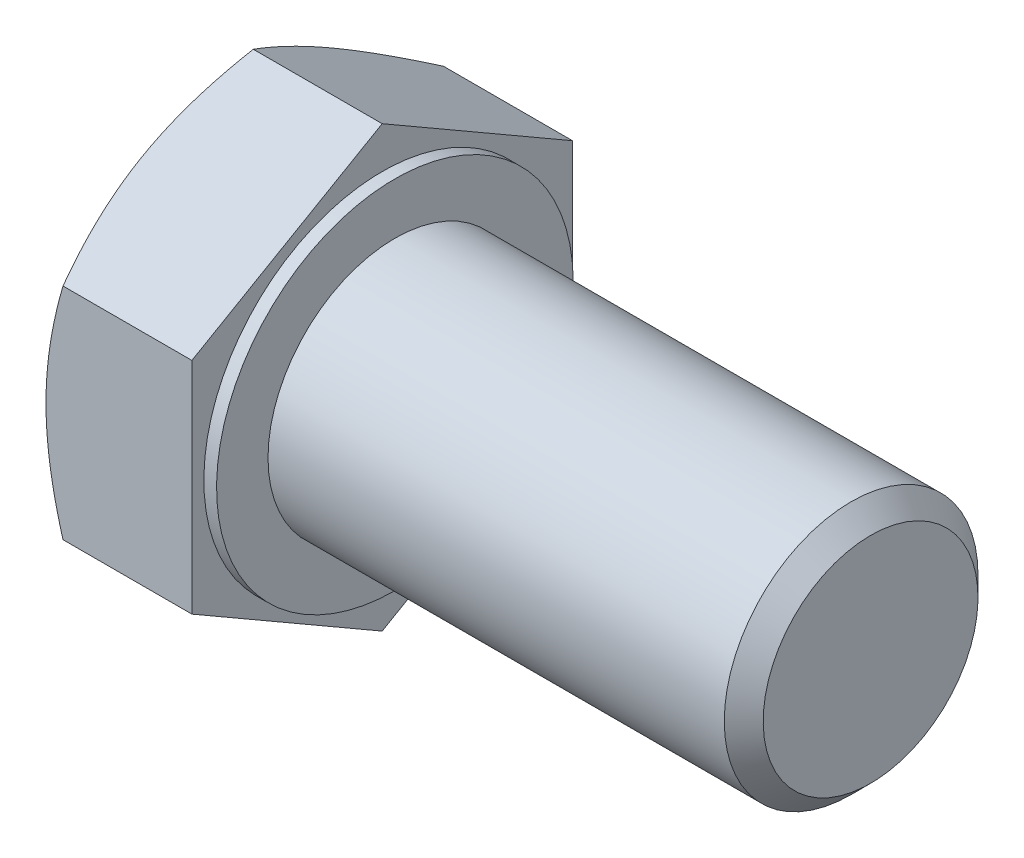
ISO-10303-21;
HEADER;
FILE_DESCRIPTION(('STEP AP214'),'2;1');
FILE_NAME('part.step','',(''),(''),'','','');
FILE_SCHEMA(('AUTOMOTIVE_DESIGN { 1 0 10303 214 1 1 1 1 }'));
ENDSEC;
DATA;
#1=APPLICATION_CONTEXT('core data for automotive mechanical design processes');
#2=APPLICATION_PROTOCOL_DEFINITION('international standard','automotive_design',2000,#1);
#3=PRODUCT_CONTEXT('',#1,'mechanical');
#4=PRODUCT('Part','Part','',(#3));
#5=PRODUCT_RELATED_PRODUCT_CATEGORY('part','',(#4));
#6=PRODUCT_DEFINITION_FORMATION('','',#4);
#7=PRODUCT_DEFINITION_CONTEXT('part definition',#1,'design');
#8=PRODUCT_DEFINITION('design','',#6,#7);
#9=PRODUCT_DEFINITION_SHAPE('','',#8);
#10=(LENGTH_UNIT() NAMED_UNIT(*) SI_UNIT(.MILLI.,.METRE.));
#11=(NAMED_UNIT(*) PLANE_ANGLE_UNIT() SI_UNIT($,.RADIAN.));
#12=(NAMED_UNIT(*) SI_UNIT($,.STERADIAN.) SOLID_ANGLE_UNIT());
#13=UNCERTAINTY_MEASURE_WITH_UNIT(LENGTH_MEASURE(1.E-05),#10,'distance_accuracy_value','');
#14=(GEOMETRIC_REPRESENTATION_CONTEXT(3) GLOBAL_UNCERTAINTY_ASSIGNED_CONTEXT((#13)) GLOBAL_UNIT_ASSIGNED_CONTEXT((#10,
#11,#12)) REPRESENTATION_CONTEXT('',''));
#15=CARTESIAN_POINT('',(0.,0.,0.));
#16=DIRECTION('',(0.,0.,1.));
#17=DIRECTION('',(1.,0.,0.));
#18=AXIS2_PLACEMENT_3D('',#15,#16,#17);
#19=CARTESIAN_POINT('',(0.,9.6225,0.));
#20=DIRECTION('',(1.,0.,0.));
#21=DIRECTION('',(0.,1.,0.));
#22=AXIS2_PLACEMENT_3D('',#19,#20,#21);
#23=PLANE('',#22);
#24=CARTESIAN_POINT('',(0.,0.,0.));
#25=DIRECTION('',(1.,0.,0.));
#26=DIRECTION('',(0.,1.,0.));
#27=AXIS2_PLACEMENT_3D('',#24,#25,#26);
#28=CIRCLE('',#27,8.);
#29=CARTESIAN_POINT('',(0.,-8.,0.));
#30=VERTEX_POINT('',#29);
#31=EDGE_CURVE('E177',#30,#30,#28,.T.);
#32=ORIENTED_EDGE('',*,*,#31,.F.);
#33=EDGE_LOOP('',(#32));
#34=FACE_BOUND('',#33,.T.);
#35=CARTESIAN_POINT('',(0.,0.,0.));
#36=DIRECTION('',(1.,0.,0.));
#37=DIRECTION('',(0.,1.,0.));
#38=AXIS2_PLACEMENT_3D('',#35,#36,#37);
#39=CIRCLE('',#38,11.245);
#40=CARTESIAN_POINT('',(0.,-11.245,0.));
#41=VERTEX_POINT('',#40);
#42=EDGE_CURVE('E27',#41,#41,#39,.T.);
#43=ORIENTED_EDGE('',*,*,#42,.T.);
#44=EDGE_LOOP('',(#43));
#45=FACE_BOUND('',#44,.T.);
#46=ADVANCED_FACE('F17',(#34,#45),#23,.T.);
#47=CARTESIAN_POINT('',(-0.40005,0.,0.));
#48=DIRECTION('',(1.,0.,0.));
#49=DIRECTION('',(0.,1.,0.));
#50=AXIS2_PLACEMENT_3D('',#47,#48,#49);
#51=CYLINDRICAL_SURFACE('',#50,11.245);
#52=ORIENTED_EDGE('',*,*,#42,.F.);
#53=DIRECTION('',(-1.,0.,0.));
#54=VECTOR('',#53,1.);
#55=CARTESIAN_POINT('',(-0.40005,-11.245,0.));
#56=LINE('',#55,#54);
#57=CARTESIAN_POINT('',(-0.8001,-11.245,0.));
#58=VERTEX_POINT('',#57);
#59=EDGE_CURVE('E11',#41,#58,#56,.T.);
#60=ORIENTED_EDGE('',*,*,#59,.T.);
#61=CARTESIAN_POINT('',(-0.8001,0.,0.));
#62=DIRECTION('',(1.,0.,0.));
#63=DIRECTION('',(0.,1.,0.));
#64=AXIS2_PLACEMENT_3D('',#61,#62,#63);
#65=CIRCLE('',#64,11.245);
#66=EDGE_CURVE('E241',#58,#58,#65,.T.);
#67=ORIENTED_EDGE('',*,*,#66,.T.);
#68=ORIENTED_EDGE('',*,*,#59,.F.);
#69=EDGE_LOOP('',(#52,#60,#67,#68));
#70=FACE_BOUND('',#69,.T.);
#71=ADVANCED_FACE('F346',(#70),#51,.T.);
#72=CARTESIAN_POINT('',(-10.0001,0.,0.));
#73=DIRECTION('',(1.,0.,0.));
#74=DIRECTION('',(0.,1.,0.));
#75=AXIS2_PLACEMENT_3D('',#72,#73,#74);
#76=PLANE('',#75);
#77=CARTESIAN_POINT('',(-10.0001,0.,0.));
#78=DIRECTION('',(-1.,0.,0.));
#79=DIRECTION('',(0.,1.,0.));
#80=AXIS2_PLACEMENT_3D('',#77,#78,#79);
#81=CIRCLE('',#80,12.);
#82=CARTESIAN_POINT('',(-10.0001,0.,12.));
#83=VERTEX_POINT('',#82);
#84=CARTESIAN_POINT('',(-10.0001,10.3923048454133,6.));
#85=VERTEX_POINT('',#84);
#86=EDGE_CURVE('E141',#83,#85,#81,.T.);
#87=ORIENTED_EDGE('',*,*,#86,.T.);
#88=CARTESIAN_POINT('',(-10.0001,0.,0.));
#89=DIRECTION('',(-1.,0.,0.));
#90=DIRECTION('',(0.,1.,0.));
#91=AXIS2_PLACEMENT_3D('',#88,#89,#90);
#92=CIRCLE('',#91,12.);
#93=CARTESIAN_POINT('',(-10.0001,10.3923048454133,-6.));
#94=VERTEX_POINT('',#93);
#95=EDGE_CURVE('E186',#85,#94,#92,.T.);
#96=ORIENTED_EDGE('',*,*,#95,.T.);
#97=CARTESIAN_POINT('',(-10.0001,0.,0.));
#98=DIRECTION('',(-1.,0.,0.));
#99=DIRECTION('',(0.,1.,0.));
#100=AXIS2_PLACEMENT_3D('',#97,#98,#99);
#101=CIRCLE('',#100,12.);
#102=CARTESIAN_POINT('',(-10.0001,0.,-12.));
#103=VERTEX_POINT('',#102);
#104=EDGE_CURVE('E200',#94,#103,#101,.T.);
#105=ORIENTED_EDGE('',*,*,#104,.T.);
#106=CARTESIAN_POINT('',(-10.0001,0.,0.));
#107=DIRECTION('',(-1.,0.,0.));
#108=DIRECTION('',(0.,1.,0.));
#109=AXIS2_PLACEMENT_3D('',#106,#107,#108);
#110=CIRCLE('',#109,12.);
#111=CARTESIAN_POINT('',(-10.0001,-10.3923048454133,-6.));
#112=VERTEX_POINT('',#111);
#113=EDGE_CURVE('E111',#103,#112,#110,.T.);
#114=ORIENTED_EDGE('',*,*,#113,.T.);
#115=CARTESIAN_POINT('',(-10.0001,0.,0.));
#116=DIRECTION('',(-1.,0.,0.));
#117=DIRECTION('',(0.,1.,0.));
#118=AXIS2_PLACEMENT_3D('',#115,#116,#117);
#119=CIRCLE('',#118,12.);
#120=CARTESIAN_POINT('',(-10.0001,-10.3923048454133,6.));
#121=VERTEX_POINT('',#120);
#122=EDGE_CURVE('E144',#112,#121,#119,.T.);
#123=ORIENTED_EDGE('',*,*,#122,.T.);
#124=CARTESIAN_POINT('',(-10.0001,0.,0.));
#125=DIRECTION('',(-1.,0.,0.));
#126=DIRECTION('',(0.,1.,0.));
#127=AXIS2_PLACEMENT_3D('',#124,#125,#126);
#128=CIRCLE('',#127,12.);
#129=EDGE_CURVE('E136',#121,#83,#128,.T.);
#130=ORIENTED_EDGE('',*,*,#129,.T.);
#131=EDGE_LOOP('',(#87,#96,#105,#114,#123,#130));
#132=FACE_BOUND('',#131,.T.);
#133=ADVANCED_FACE('F138',(#132),#76,.F.);
#134=CARTESIAN_POINT('',(-0.8001,-13.856406460551,0.));
#135=DIRECTION('',(0.,-0.866025403784439,-0.5));
#136=DIRECTION('',(0.,0.5,-0.866025403784439));
#137=AXIS2_PLACEMENT_3D('',#134,#135,#136);
#138=PLANE('',#137);
#139=CARTESIAN_POINT('',(-10.0001,-10.3923048454133,-6.));
#140=CARTESIAN_POINT('',(-10.0001,-8.78460969082653,-8.78460969082651));
#141=CARTESIAN_POINT('',(-8.92830323027553,-6.92820323027552,-12.));
#142=(BOUNDED_CURVE() B_SPLINE_CURVE(2,(#139,#140,#141),.UNSPECIFIED.,.F.,
.F.) B_SPLINE_CURVE_WITH_KNOTS((3,3),(0.702851662530288,1.40570332506057),
.UNSPECIFIED.) CURVE() GEOMETRIC_REPRESENTATION_ITEM() RATIONAL_B_SPLINE_CURVE((1.,
1.03795484930205,1.)) REPRESENTATION_ITEM(''));
#143=CARTESIAN_POINT('',(-8.92830323027553,-6.92820323027552,-12.));
#144=VERTEX_POINT('',#143);
#145=EDGE_CURVE('E230',#112,#144,#142,.T.);
#146=ORIENTED_EDGE('',*,*,#145,.T.);
#147=DIRECTION('',(-1.,0.,0.));
#148=VECTOR('',#147,1.);
#149=CARTESIAN_POINT('',(-0.8001,-6.9282032302755,-12.));
#150=LINE('',#149,#148);
#151=CARTESIAN_POINT('',(-0.8001,-6.9282032302755,-12.));
#152=VERTEX_POINT('',#151);
#153=EDGE_CURVE('E296',#152,#144,#150,.T.);
#154=ORIENTED_EDGE('',*,*,#153,.F.);
#155=DIRECTION('',(0.,0.5,-0.866025403784439));
#156=VECTOR('',#155,1.);
#157=CARTESIAN_POINT('',(-0.8001,-13.856406460551,0.));
#158=LINE('',#157,#156);
#159=CARTESIAN_POINT('',(-0.8001,-13.856406460551,0.));
#160=VERTEX_POINT('',#159);
#161=EDGE_CURVE('E238',#160,#152,#158,.T.);
#162=ORIENTED_EDGE('',*,*,#161,.F.);
#163=DIRECTION('',(-1.,0.,0.));
#164=VECTOR('',#163,1.);
#165=CARTESIAN_POINT('',(-0.8001,-13.856406460551,0.));
#166=LINE('',#165,#164);
#167=CARTESIAN_POINT('',(-8.92830323027553,-13.856406460551,0.));
#168=VERTEX_POINT('',#167);
#169=EDGE_CURVE('E208',#160,#168,#166,.T.);
#170=ORIENTED_EDGE('',*,*,#169,.T.);
#171=CARTESIAN_POINT('',(-8.92830323027554,-13.856406460551,0.));
#172=CARTESIAN_POINT('',(-10.0001,-12.,-3.21539030917348));
#173=CARTESIAN_POINT('',(-10.0001,-10.3923048454133,-6.));
#174=(BOUNDED_CURVE() B_SPLINE_CURVE(2,(#171,#172,#173),.UNSPECIFIED.,.F.,
.F.) B_SPLINE_CURVE_WITH_KNOTS((3,3),(0.,0.702851662530288),
.UNSPECIFIED.) CURVE() GEOMETRIC_REPRESENTATION_ITEM() RATIONAL_B_SPLINE_CURVE((1.,
1.03795484930205,1.)) REPRESENTATION_ITEM(''));
#175=EDGE_CURVE('E222',#168,#112,#174,.T.);
#176=ORIENTED_EDGE('',*,*,#175,.T.);
#177=EDGE_LOOP('',(#146,#154,#162,#170,#176));
#178=FACE_BOUND('',#177,.T.);
#179=ADVANCED_FACE('F387',(#178),#138,.T.);
#180=CARTESIAN_POINT('',(-0.8001,-6.92820323027551,12.));
#181=DIRECTION('',(0.,-0.866025403784439,0.5));
#182=DIRECTION('',(-1.,0.,0.));
#183=AXIS2_PLACEMENT_3D('',#180,#181,#182);
#184=PLANE('',#183);
#185=CARTESIAN_POINT('',(-10.0001,-10.3923048454133,6.));
#186=CARTESIAN_POINT('',(-10.0001,-12.,3.21539030917348));
#187=CARTESIAN_POINT('',(-8.92830323027553,-13.856406460551,0.));
#188=(BOUNDED_CURVE() B_SPLINE_CURVE(2,(#185,#186,#187),.UNSPECIFIED.,.F.,
.F.) B_SPLINE_CURVE_WITH_KNOTS((3,3),(0.702851662530287,1.40570332506057),
.UNSPECIFIED.) CURVE() GEOMETRIC_REPRESENTATION_ITEM() RATIONAL_B_SPLINE_CURVE((1.,
1.03795484930206,1.)) REPRESENTATION_ITEM(''));
#189=EDGE_CURVE('E193',#121,#168,#188,.T.);
#190=ORIENTED_EDGE('',*,*,#189,.T.);
#191=ORIENTED_EDGE('',*,*,#169,.F.);
#192=DIRECTION('',(0.,-0.5,-0.866025403784439));
#193=VECTOR('',#192,1.);
#194=CARTESIAN_POINT('',(-0.8001,-6.92820323027551,12.));
#195=LINE('',#194,#193);
#196=CARTESIAN_POINT('',(-0.8001,-6.92820323027551,12.));
#197=VERTEX_POINT('',#196);
#198=EDGE_CURVE('E242',#197,#160,#195,.T.);
#199=ORIENTED_EDGE('',*,*,#198,.F.);
#200=DIRECTION('',(-1.,0.,0.));
#201=VECTOR('',#200,1.);
#202=CARTESIAN_POINT('',(-0.8001,-6.92820323027551,12.));
#203=LINE('',#202,#201);
#204=CARTESIAN_POINT('',(-8.92830323027553,-6.92820323027548,12.));
#205=VERTEX_POINT('',#204);
#206=EDGE_CURVE('E210',#197,#205,#203,.T.);
#207=ORIENTED_EDGE('',*,*,#206,.T.);
#208=CARTESIAN_POINT('',(-8.92830323027553,-6.92820323027554,12.));
#209=CARTESIAN_POINT('',(-10.0001,-8.78460969082653,8.78460969082652));
#210=CARTESIAN_POINT('',(-10.0001,-10.3923048454133,6.));
#211=(BOUNDED_CURVE() B_SPLINE_CURVE(2,(#208,#209,#210),.UNSPECIFIED.,.F.,
.F.) B_SPLINE_CURVE_WITH_KNOTS((3,3),(0.,0.702851662530287),
.UNSPECIFIED.) CURVE() GEOMETRIC_REPRESENTATION_ITEM() RATIONAL_B_SPLINE_CURVE((1.,
1.03795484930205,1.)) REPRESENTATION_ITEM(''));
#212=EDGE_CURVE('E156',#205,#121,#211,.T.);
#213=ORIENTED_EDGE('',*,*,#212,.T.);
#214=EDGE_LOOP('',(#190,#191,#199,#207,#213));
#215=FACE_BOUND('',#214,.T.);
#216=ADVANCED_FACE('F361',(#215),#184,.T.);
#217=CARTESIAN_POINT('',(-0.8001,6.9282032302755,12.));
#218=DIRECTION('',(0.,0.,1.));
#219=DIRECTION('',(0.,-1.,0.));
#220=AXIS2_PLACEMENT_3D('',#217,#218,#219);
#221=PLANE('',#220);
#222=CARTESIAN_POINT('',(-10.0001,0.,12.));
#223=CARTESIAN_POINT('',(-10.0001,-3.21539030917347,12.));
#224=CARTESIAN_POINT('',(-8.92830323027553,-6.92820323027548,12.));
#225=(BOUNDED_CURVE() B_SPLINE_CURVE(2,(#222,#223,#224),.UNSPECIFIED.,.F.,
.F.) B_SPLINE_CURVE_WITH_KNOTS((3,3),(0.702851662530288,1.40570332506058),
.UNSPECIFIED.) CURVE() GEOMETRIC_REPRESENTATION_ITEM() RATIONAL_B_SPLINE_CURVE((1.,
1.03795484930205,1.)) REPRESENTATION_ITEM(''));
#226=EDGE_CURVE('E151',#83,#205,#225,.T.);
#227=ORIENTED_EDGE('',*,*,#226,.T.);
#228=ORIENTED_EDGE('',*,*,#206,.F.);
#229=DIRECTION('',(0.,-1.,0.));
#230=VECTOR('',#229,1.);
#231=CARTESIAN_POINT('',(-0.8001,6.9282032302755,12.));
#232=LINE('',#231,#230);
#233=CARTESIAN_POINT('',(-0.8001,6.9282032302755,12.));
#234=VERTEX_POINT('',#233);
#235=EDGE_CURVE('E311',#234,#197,#232,.T.);
#236=ORIENTED_EDGE('',*,*,#235,.F.);
#237=DIRECTION('',(-1.,0.,0.));
#238=VECTOR('',#237,1.);
#239=CARTESIAN_POINT('',(-0.8001,6.9282032302755,12.));
#240=LINE('',#239,#238);
#241=CARTESIAN_POINT('',(-8.92830323027553,6.92820323027546,12.));
#242=VERTEX_POINT('',#241);
#243=EDGE_CURVE('E164',#234,#242,#240,.T.);
#244=ORIENTED_EDGE('',*,*,#243,.T.);
#245=CARTESIAN_POINT('',(-8.92830323027554,6.92820323027546,12.));
#246=CARTESIAN_POINT('',(-10.0001,3.21539030917344,12.));
#247=CARTESIAN_POINT('',(-10.0001,0.,12.));
#248=(BOUNDED_CURVE() B_SPLINE_CURVE(2,(#245,#246,#247),.UNSPECIFIED.,.F.,
.F.) B_SPLINE_CURVE_WITH_KNOTS((3,3),(0.,0.702851662530288),
.UNSPECIFIED.) CURVE() GEOMETRIC_REPRESENTATION_ITEM() RATIONAL_B_SPLINE_CURVE((1.,
1.03795484930203,1.)) REPRESENTATION_ITEM(''));
#249=EDGE_CURVE('E161',#242,#83,#248,.T.);
#250=ORIENTED_EDGE('',*,*,#249,.T.);
#251=EDGE_LOOP('',(#227,#228,#236,#244,#250));
#252=FACE_BOUND('',#251,.T.);
#253=ADVANCED_FACE('F162',(#252),#221,.T.);
#254=CARTESIAN_POINT('',(-0.8001,0.,0.));
#255=DIRECTION('',(1.,0.,0.));
#256=DIRECTION('',(0.,1.,0.));
#257=AXIS2_PLACEMENT_3D('',#254,#255,#256);
#258=PLANE('',#257);
#259=ORIENTED_EDGE('',*,*,#66,.F.);
#260=EDGE_LOOP('',(#259));
#261=FACE_BOUND('',#260,.T.);
#262=DIRECTION('',(0.,-0.5,0.866025403784438));
#263=VECTOR('',#262,1.);
#264=CARTESIAN_POINT('',(-0.8001,13.856406460551,0.));
#265=LINE('',#264,#263);
#266=CARTESIAN_POINT('',(-0.8001,13.856406460551,0.));
#267=VERTEX_POINT('',#266);
#268=EDGE_CURVE('E206',#267,#234,#265,.T.);
#269=ORIENTED_EDGE('',*,*,#268,.T.);
#270=ORIENTED_EDGE('',*,*,#235,.T.);
#271=ORIENTED_EDGE('',*,*,#198,.T.);
#272=ORIENTED_EDGE('',*,*,#161,.T.);
#273=DIRECTION('',(0.,1.,0.));
#274=VECTOR('',#273,1.);
#275=CARTESIAN_POINT('',(-0.8001,-6.9282032302755,-12.));
#276=LINE('',#275,#274);
#277=CARTESIAN_POINT('',(-0.8001,6.92820323027551,-12.));
#278=VERTEX_POINT('',#277);
#279=EDGE_CURVE('E275',#152,#278,#276,.T.);
#280=ORIENTED_EDGE('',*,*,#279,.T.);
#281=DIRECTION('',(0.,0.5,0.866025403784439));
#282=VECTOR('',#281,1.);
#283=CARTESIAN_POINT('',(-0.8001,6.92820323027551,-12.));
#284=LINE('',#283,#282);
#285=EDGE_CURVE('E207',#278,#267,#284,.T.);
#286=ORIENTED_EDGE('',*,*,#285,.T.);
#287=EDGE_LOOP('',(#269,#270,#271,#272,#280,#286));
#288=FACE_BOUND('',#287,.T.);
#289=ADVANCED_FACE('F349',(#261,#288),#258,.T.);
#290=CARTESIAN_POINT('',(-0.8001,13.856406460551,0.));
#291=DIRECTION('',(0.,0.866025403784438,0.5));
#292=DIRECTION('',(1.,0.,0.));
#293=AXIS2_PLACEMENT_3D('',#290,#291,#292);
#294=PLANE('',#293);
#295=CARTESIAN_POINT('',(-8.92830323027554,13.856406460551,0.));
#296=CARTESIAN_POINT('',(-10.0001,12.,3.21539030917351));
#297=CARTESIAN_POINT('',(-10.0001,10.3923048454133,6.));
#298=(BOUNDED_CURVE() B_SPLINE_CURVE(2,(#295,#296,#297),.UNSPECIFIED.,.F.,
.F.) B_SPLINE_CURVE_WITH_KNOTS((3,3),(0.,0.702851662530288),
.UNSPECIFIED.) CURVE() GEOMETRIC_REPRESENTATION_ITEM() RATIONAL_B_SPLINE_CURVE((1.,
1.03795484930205,1.)) REPRESENTATION_ITEM(''));
#299=CARTESIAN_POINT('',(-8.92830323027553,13.856406460551,0.));
#300=VERTEX_POINT('',#299);
#301=EDGE_CURVE('E243',#300,#85,#298,.T.);
#302=ORIENTED_EDGE('',*,*,#301,.T.);
#303=CARTESIAN_POINT('',(-10.0001,10.3923048454133,6.));
#304=CARTESIAN_POINT('',(-10.0001,8.78460969082653,8.78460969082649));
#305=CARTESIAN_POINT('',(-8.92830323027554,6.92820323027551,12.));
#306=(BOUNDED_CURVE() B_SPLINE_CURVE(2,(#303,#304,#305),.UNSPECIFIED.,.F.,
.F.) B_SPLINE_CURVE_WITH_KNOTS((3,3),(0.702851662530288,1.40570332506058),
.UNSPECIFIED.) CURVE() GEOMETRIC_REPRESENTATION_ITEM() RATIONAL_B_SPLINE_CURVE((1.,
1.03795484930204,1.)) REPRESENTATION_ITEM(''));
#307=EDGE_CURVE('E170',#85,#242,#306,.T.);
#308=ORIENTED_EDGE('',*,*,#307,.T.);
#309=ORIENTED_EDGE('',*,*,#243,.F.);
#310=ORIENTED_EDGE('',*,*,#268,.F.);
#311=DIRECTION('',(-1.,0.,0.));
#312=VECTOR('',#311,1.);
#313=CARTESIAN_POINT('',(-0.8001,13.856406460551,0.));
#314=LINE('',#313,#312);
#315=EDGE_CURVE('E237',#267,#300,#314,.T.);
#316=ORIENTED_EDGE('',*,*,#315,.T.);
#317=EDGE_LOOP('',(#302,#308,#309,#310,#316));
#318=FACE_BOUND('',#317,.T.);
#319=ADVANCED_FACE('F351',(#318),#294,.T.);
#320=CARTESIAN_POINT('',(-0.8001,6.92820323027551,-12.));
#321=DIRECTION('',(0.,0.866025403784439,-0.5));
#322=DIRECTION('',(-1.,0.,0.));
#323=AXIS2_PLACEMENT_3D('',#320,#321,#322);
#324=PLANE('',#323);
#325=CARTESIAN_POINT('',(-8.92830323027553,6.92820323027552,-12.));
#326=CARTESIAN_POINT('',(-10.0001,8.78460969082652,-8.78460969082651));
#327=CARTESIAN_POINT('',(-10.0001,10.3923048454133,-6.));
#328=(BOUNDED_CURVE() B_SPLINE_CURVE(2,(#325,#326,#327),.UNSPECIFIED.,.F.,
.F.) B_SPLINE_CURVE_WITH_KNOTS((3,3),(0.,0.702851662530289),
.UNSPECIFIED.) CURVE() GEOMETRIC_REPRESENTATION_ITEM() RATIONAL_B_SPLINE_CURVE((1.,
1.03795484930204,1.)) REPRESENTATION_ITEM(''));
#329=CARTESIAN_POINT('',(-8.92830323027553,6.92820323027548,-12.));
#330=VERTEX_POINT('',#329);
#331=EDGE_CURVE('E194',#330,#94,#328,.T.);
#332=ORIENTED_EDGE('',*,*,#331,.T.);
#333=CARTESIAN_POINT('',(-10.0001,10.3923048454133,-6.));
#334=CARTESIAN_POINT('',(-10.0001,12.,-3.21539030917347));
#335=CARTESIAN_POINT('',(-8.92830323027553,13.856406460551,0.));
#336=(BOUNDED_CURVE() B_SPLINE_CURVE(2,(#333,#334,#335),.UNSPECIFIED.,.F.,
.F.) B_SPLINE_CURVE_WITH_KNOTS((3,3),(0.702851662530289,1.40570332506058),
.UNSPECIFIED.) CURVE() GEOMETRIC_REPRESENTATION_ITEM() RATIONAL_B_SPLINE_CURVE((1.,
1.03795484930205,1.)) REPRESENTATION_ITEM(''));
#337=EDGE_CURVE('E150',#94,#300,#336,.T.);
#338=ORIENTED_EDGE('',*,*,#337,.T.);
#339=ORIENTED_EDGE('',*,*,#315,.F.);
#340=ORIENTED_EDGE('',*,*,#285,.F.);
#341=DIRECTION('',(-1.,0.,0.));
#342=VECTOR('',#341,1.);
#343=CARTESIAN_POINT('',(-0.8001,6.92820323027551,-12.));
#344=LINE('',#343,#342);
#345=EDGE_CURVE('E269',#278,#330,#344,.T.);
#346=ORIENTED_EDGE('',*,*,#345,.T.);
#347=EDGE_LOOP('',(#332,#338,#339,#340,#346));
#348=FACE_BOUND('',#347,.T.);
#349=ADVANCED_FACE('F358',(#348),#324,.T.);
#350=CARTESIAN_POINT('',(-0.8001,-6.9282032302755,-12.));
#351=DIRECTION('',(0.,0.,-1.));
#352=DIRECTION('',(-1.,0.,0.));
#353=AXIS2_PLACEMENT_3D('',#350,#351,#352);
#354=PLANE('',#353);
#355=CARTESIAN_POINT('',(-8.92830323027553,-6.92820323027547,-12.));
#356=CARTESIAN_POINT('',(-10.0001,-3.21539030917344,-12.));
#357=CARTESIAN_POINT('',(-10.0001,0.,-12.));
#358=(BOUNDED_CURVE() B_SPLINE_CURVE(2,(#355,#356,#357),.UNSPECIFIED.,.F.,
.F.) B_SPLINE_CURVE_WITH_KNOTS((3,3),(0.,0.702851662530288),
.UNSPECIFIED.) CURVE() GEOMETRIC_REPRESENTATION_ITEM() RATIONAL_B_SPLINE_CURVE((1.,
1.03795484930204,1.)) REPRESENTATION_ITEM(''));
#359=EDGE_CURVE('E199',#144,#103,#358,.T.);
#360=ORIENTED_EDGE('',*,*,#359,.T.);
#361=CARTESIAN_POINT('',(-10.0001,0.,-12.));
#362=CARTESIAN_POINT('',(-10.0001,3.21539030917345,-12.));
#363=CARTESIAN_POINT('',(-8.92830323027553,6.92820323027548,-12.));
#364=(BOUNDED_CURVE() B_SPLINE_CURVE(2,(#361,#362,#363),.UNSPECIFIED.,.F.,
.F.) B_SPLINE_CURVE_WITH_KNOTS((3,3),(0.702851662530288,1.40570332506058),
.UNSPECIFIED.) CURVE() GEOMETRIC_REPRESENTATION_ITEM() RATIONAL_B_SPLINE_CURVE((1.,
1.03795484930205,1.)) REPRESENTATION_ITEM(''));
#365=EDGE_CURVE('E192',#103,#330,#364,.T.);
#366=ORIENTED_EDGE('',*,*,#365,.T.);
#367=ORIENTED_EDGE('',*,*,#345,.F.);
#368=ORIENTED_EDGE('',*,*,#279,.F.);
#369=ORIENTED_EDGE('',*,*,#153,.T.);
#370=EDGE_LOOP('',(#360,#366,#367,#368,#369));
#371=FACE_BOUND('',#370,.T.);
#372=ADVANCED_FACE('F379',(#371),#354,.T.);
#373=CARTESIAN_POINT('',(-9.46420161513777,0.,0.));
#374=DIRECTION('',(1.,0.,0.));
#375=DIRECTION('',(0.,1.,0.));
#376=AXIS2_PLACEMENT_3D('',#373,#374,#375);
#377=CONICAL_SURFACE('',#376,12.9282032302755,1.0471975511966);
#378=ORIENTED_EDGE('',*,*,#359,.F.);
#379=ORIENTED_EDGE('',*,*,#145,.F.);
#380=ORIENTED_EDGE('',*,*,#113,.F.);
#381=EDGE_LOOP('',(#378,#379,#380));
#382=FACE_BOUND('',#381,.T.);
#383=ADVANCED_FACE('F382',(#382),#377,.T.);
#384=CARTESIAN_POINT('',(-9.46420161513777,0.,0.));
#385=DIRECTION('',(1.,0.,0.));
#386=DIRECTION('',(0.,1.,0.));
#387=AXIS2_PLACEMENT_3D('',#384,#385,#386);
#388=CONICAL_SURFACE('',#387,12.9282032302755,1.0471975511966);
#389=ORIENTED_EDGE('',*,*,#365,.F.);
#390=ORIENTED_EDGE('',*,*,#104,.F.);
#391=ORIENTED_EDGE('',*,*,#331,.F.);
#392=EDGE_LOOP('',(#389,#390,#391));
#393=FACE_BOUND('',#392,.T.);
#394=ADVANCED_FACE('F19',(#393),#388,.T.);
#395=CARTESIAN_POINT('',(-9.46420161513777,0.,0.));
#396=DIRECTION('',(1.,0.,0.));
#397=DIRECTION('',(0.,-1.,0.));
#398=AXIS2_PLACEMENT_3D('',#395,#396,#397);
#399=CONICAL_SURFACE('',#398,12.9282032302755,1.0471975511966);
#400=ORIENTED_EDGE('',*,*,#175,.F.);
#401=ORIENTED_EDGE('',*,*,#189,.F.);
#402=ORIENTED_EDGE('',*,*,#122,.F.);
#403=EDGE_LOOP('',(#400,#401,#402));
#404=FACE_BOUND('',#403,.T.);
#405=ADVANCED_FACE('F466',(#404),#399,.T.);
#406=CARTESIAN_POINT('',(-9.46420161513777,0.,0.));
#407=DIRECTION('',(1.,0.,0.));
#408=DIRECTION('',(0.,1.,0.));
#409=AXIS2_PLACEMENT_3D('',#406,#407,#408);
#410=CONICAL_SURFACE('',#409,12.9282032302755,1.0471975511966);
#411=ORIENTED_EDGE('',*,*,#337,.F.);
#412=ORIENTED_EDGE('',*,*,#95,.F.);
#413=ORIENTED_EDGE('',*,*,#301,.F.);
#414=EDGE_LOOP('',(#411,#412,#413));
#415=FACE_BOUND('',#414,.T.);
#416=ADVANCED_FACE('F399',(#415),#410,.T.);
#417=CARTESIAN_POINT('',(-9.46420161513777,0.,0.));
#418=DIRECTION('',(1.,0.,0.));
#419=DIRECTION('',(0.,1.,0.));
#420=AXIS2_PLACEMENT_3D('',#417,#418,#419);
#421=CONICAL_SURFACE('',#420,12.9282032302755,1.0471975511966);
#422=ORIENTED_EDGE('',*,*,#212,.F.);
#423=ORIENTED_EDGE('',*,*,#226,.F.);
#424=ORIENTED_EDGE('',*,*,#129,.F.);
#425=EDGE_LOOP('',(#422,#423,#424));
#426=FACE_BOUND('',#425,.T.);
#427=ADVANCED_FACE('F155',(#426),#421,.T.);
#428=CARTESIAN_POINT('',(-9.46420161513777,0.,0.));
#429=DIRECTION('',(1.,0.,0.));
#430=DIRECTION('',(0.,1.,0.));
#431=AXIS2_PLACEMENT_3D('',#428,#429,#430);
#432=CONICAL_SURFACE('',#431,12.9282032302755,1.0471975511966);
#433=ORIENTED_EDGE('',*,*,#307,.F.);
#434=ORIENTED_EDGE('',*,*,#86,.F.);
#435=ORIENTED_EDGE('',*,*,#249,.F.);
#436=EDGE_LOOP('',(#433,#434,#435));
#437=FACE_BOUND('',#436,.T.);
#438=ADVANCED_FACE('F169',(#437),#432,.T.);
#439=CARTESIAN_POINT('',(30.,4.,0.));
#440=DIRECTION('',(1.,0.,0.));
#441=DIRECTION('',(0.,1.,0.));
#442=AXIS2_PLACEMENT_3D('',#439,#440,#441);
#443=PLANE('',#442);
#444=CARTESIAN_POINT('',(30.,0.,0.));
#445=DIRECTION('',(-1.,0.,0.));
#446=DIRECTION('',(0.,-1.,0.));
#447=AXIS2_PLACEMENT_3D('',#444,#445,#446);
#448=CIRCLE('',#447,6.7731);
#449=CARTESIAN_POINT('',(30.,6.7731,0.));
#450=VERTEX_POINT('',#449);
#451=EDGE_CURVE('E256',#450,#450,#448,.T.);
#452=ORIENTED_EDGE('',*,*,#451,.F.);
#453=EDGE_LOOP('',(#452));
#454=FACE_BOUND('',#453,.T.);
#455=ADVANCED_FACE('F393',(#454),#443,.T.);
#456=CARTESIAN_POINT('',(18.,0.,0.));
#457=DIRECTION('',(1.,0.,0.));
#458=DIRECTION('',(0.,1.,0.));
#459=AXIS2_PLACEMENT_3D('',#456,#457,#458);
#460=CYLINDRICAL_SURFACE('',#459,8.);
#461=CARTESIAN_POINT('',(28.773,0.,0.));
#462=DIRECTION('',(1.,0.,0.));
#463=DIRECTION('',(0.,-1.,0.));
#464=AXIS2_PLACEMENT_3D('',#461,#462,#463);
#465=CIRCLE('',#464,8.);
#466=CARTESIAN_POINT('',(28.773,8.,0.));
#467=VERTEX_POINT('',#466);
#468=CARTESIAN_POINT('',(28.773,-8.,0.));
#469=VERTEX_POINT('',#468);
#470=EDGE_CURVE('E299',#467,#469,#465,.T.);
#471=ORIENTED_EDGE('',*,*,#470,.F.);
#472=CARTESIAN_POINT('',(28.773,0.,0.));
#473=DIRECTION('',(1.,0.,0.));
#474=DIRECTION('',(0.,-1.,0.));
#475=AXIS2_PLACEMENT_3D('',#472,#473,#474);
#476=CIRCLE('',#475,8.);
#477=EDGE_CURVE('E286',#469,#467,#476,.T.);
#478=ORIENTED_EDGE('',*,*,#477,.F.);
#479=DIRECTION('',(-1.,0.,0.));
#480=VECTOR('',#479,1.);
#481=CARTESIAN_POINT('',(18.,-8.,0.));
#482=LINE('',#481,#480);
#483=EDGE_CURVE('E279',#469,#30,#482,.T.);
#484=ORIENTED_EDGE('',*,*,#483,.T.);
#485=ORIENTED_EDGE('',*,*,#31,.T.);
#486=ORIENTED_EDGE('',*,*,#483,.F.);
#487=EDGE_LOOP('',(#471,#478,#484,#485,#486));
#488=FACE_BOUND('',#487,.T.);
#489=ADVANCED_FACE('F377',(#488),#460,.T.);
#490=CARTESIAN_POINT('',(29.3865,0.,0.));
#491=DIRECTION('',(-1.,0.,0.));
#492=DIRECTION('',(0.,-1.,0.));
#493=AXIS2_PLACEMENT_3D('',#490,#491,#492);
#494=CONICAL_SURFACE('',#493,7.38655,0.785357411940605);
#495=ORIENTED_EDGE('',*,*,#451,.T.);
#496=DIRECTION('',(-0.707135596230877,0.707077964967939,0.));
#497=VECTOR('',#496,1.);
#498=CARTESIAN_POINT('',(29.3865,7.38655,0.));
#499=LINE('',#498,#497);
#500=EDGE_CURVE('E263',#450,#467,#499,.T.);
#501=ORIENTED_EDGE('',*,*,#500,.T.);
#502=ORIENTED_EDGE('',*,*,#470,.T.);
#503=ORIENTED_EDGE('',*,*,#477,.T.);
#504=ORIENTED_EDGE('',*,*,#500,.F.);
#505=EDGE_LOOP('',(#495,#501,#502,#503,#504));
#506=FACE_BOUND('',#505,.T.);
#507=ADVANCED_FACE('F374',(#506),#494,.T.);
#508=CLOSED_SHELL('',(#46,#71,#133,#179,#216,#253,#289,#319,#349,#372,#383,#394,#405,#416,#427,
#438,#455,#489,#507));
#509=MANIFOLD_SOLID_BREP('B1',#508);
#510=ADVANCED_BREP_SHAPE_REPRESENTATION('',(#18,#509),#14);
#511=SHAPE_DEFINITION_REPRESENTATION(#9,#510);
ENDSEC;
END-ISO-10303-21;
